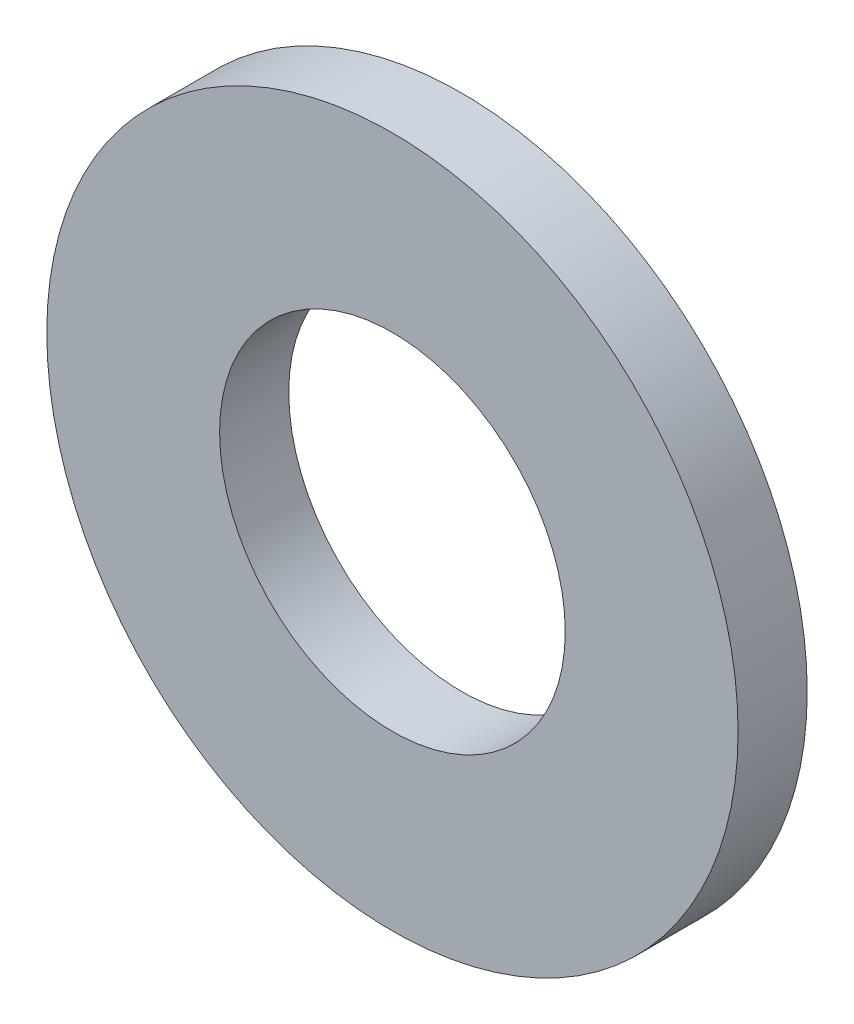
ISO-10303-21;
HEADER;
FILE_DESCRIPTION(('STEP AP214'),'2;1');
FILE_NAME('part.step','',(''),(''),'','','');
FILE_SCHEMA(('AUTOMOTIVE_DESIGN { 1 0 10303 214 1 1 1 1 }'));
ENDSEC;
DATA;
#1=APPLICATION_CONTEXT('core data for automotive mechanical design processes');
#2=APPLICATION_PROTOCOL_DEFINITION('international standard','automotive_design',2000,#1);
#3=PRODUCT_CONTEXT('',#1,'mechanical');
#4=PRODUCT('Part','Part','',(#3));
#5=PRODUCT_RELATED_PRODUCT_CATEGORY('part','',(#4));
#6=PRODUCT_DEFINITION_FORMATION('','',#4);
#7=PRODUCT_DEFINITION_CONTEXT('part definition',#1,'design');
#8=PRODUCT_DEFINITION('design','',#6,#7);
#9=PRODUCT_DEFINITION_SHAPE('','',#8);
#10=(LENGTH_UNIT() NAMED_UNIT(*) SI_UNIT(.MILLI.,.METRE.));
#11=(NAMED_UNIT(*) PLANE_ANGLE_UNIT() SI_UNIT($,.RADIAN.));
#12=(NAMED_UNIT(*) SI_UNIT($,.STERADIAN.) SOLID_ANGLE_UNIT());
#13=UNCERTAINTY_MEASURE_WITH_UNIT(LENGTH_MEASURE(1.E-05),#10,'distance_accuracy_value','');
#14=(GEOMETRIC_REPRESENTATION_CONTEXT(3) GLOBAL_UNCERTAINTY_ASSIGNED_CONTEXT((#13)) GLOBAL_UNIT_ASSIGNED_CONTEXT((#10,
#11,#12)) REPRESENTATION_CONTEXT('',''));
#15=CARTESIAN_POINT('',(0.,0.,0.));
#16=DIRECTION('',(0.,0.,1.));
#17=DIRECTION('',(1.,0.,0.));
#18=AXIS2_PLACEMENT_3D('',#15,#16,#17);
#19=CARTESIAN_POINT('',(0.,0.,5.));
#20=DIRECTION('',(0.,0.,1.));
#21=DIRECTION('',(1.,0.,0.));
#22=AXIS2_PLACEMENT_3D('',#19,#20,#21);
#23=PLANE('',#22);
#24=CARTESIAN_POINT('',(0.,0.,5.));
#25=DIRECTION('',(0.,0.,1.));
#26=DIRECTION('',(1.,0.,0.));
#27=AXIS2_PLACEMENT_3D('',#24,#25,#26);
#28=CIRCLE('',#27,25.);
#29=CARTESIAN_POINT('',(25.,0.,5.));
#30=VERTEX_POINT('',#29);
#31=EDGE_CURVE('E10',#30,#30,#28,.T.);
#32=ORIENTED_EDGE('',*,*,#31,.T.);
#33=EDGE_LOOP('',(#32));
#34=FACE_BOUND('',#33,.T.);
#35=CARTESIAN_POINT('',(0.,0.,5.));
#36=DIRECTION('',(0.,0.,1.));
#37=DIRECTION('',(1.,0.,0.));
#38=AXIS2_PLACEMENT_3D('',#35,#36,#37);
#39=CIRCLE('',#38,12.5);
#40=CARTESIAN_POINT('',(12.5,0.,5.));
#41=VERTEX_POINT('',#40);
#42=EDGE_CURVE('E56',#41,#41,#39,.T.);
#43=ORIENTED_EDGE('',*,*,#42,.F.);
#44=EDGE_LOOP('',(#43));
#45=FACE_BOUND('',#44,.T.);
#46=ADVANCED_FACE('F43',(#34,#45),#23,.T.);
#47=CARTESIAN_POINT('',(0.,0.,0.));
#48=DIRECTION('',(0.,0.,1.));
#49=DIRECTION('',(1.,0.,0.));
#50=AXIS2_PLACEMENT_3D('',#47,#48,#49);
#51=PLANE('',#50);
#52=CARTESIAN_POINT('',(0.,0.,0.));
#53=DIRECTION('',(0.,0.,1.));
#54=DIRECTION('',(1.,0.,0.));
#55=AXIS2_PLACEMENT_3D('',#52,#53,#54);
#56=CIRCLE('',#55,25.);
#57=CARTESIAN_POINT('',(25.,0.,0.));
#58=VERTEX_POINT('',#57);
#59=EDGE_CURVE('E47',#58,#58,#56,.T.);
#60=ORIENTED_EDGE('',*,*,#59,.F.);
#61=EDGE_LOOP('',(#60));
#62=FACE_BOUND('',#61,.T.);
#63=CARTESIAN_POINT('',(0.,0.,0.));
#64=DIRECTION('',(0.,0.,1.));
#65=DIRECTION('',(1.,0.,0.));
#66=AXIS2_PLACEMENT_3D('',#63,#64,#65);
#67=CIRCLE('',#66,12.5);
#68=CARTESIAN_POINT('',(12.5,0.,0.));
#69=VERTEX_POINT('',#68);
#70=EDGE_CURVE('E58',#69,#69,#67,.T.);
#71=ORIENTED_EDGE('',*,*,#70,.T.);
#72=EDGE_LOOP('',(#71));
#73=FACE_BOUND('',#72,.T.);
#74=ADVANCED_FACE('F70',(#62,#73),#51,.F.);
#75=CARTESIAN_POINT('',(0.,0.,5.));
#76=DIRECTION('',(0.,0.,-1.));
#77=DIRECTION('',(-1.,0.,0.));
#78=AXIS2_PLACEMENT_3D('',#75,#76,#77);
#79=CYLINDRICAL_SURFACE('',#78,25.);
#80=ORIENTED_EDGE('',*,*,#31,.F.);
#81=EDGE_LOOP('',(#80));
#82=FACE_BOUND('',#81,.T.);
#83=ORIENTED_EDGE('',*,*,#59,.T.);
#84=EDGE_LOOP('',(#83));
#85=FACE_BOUND('',#84,.T.);
#86=ADVANCED_FACE('F45',(#82,#85),#79,.T.);
#87=CARTESIAN_POINT('',(0.,0.,5.));
#88=DIRECTION('',(0.,0.,-1.));
#89=DIRECTION('',(-1.,0.,0.));
#90=AXIS2_PLACEMENT_3D('',#87,#88,#89);
#91=CYLINDRICAL_SURFACE('',#90,12.5);
#92=ORIENTED_EDGE('',*,*,#42,.T.);
#93=EDGE_LOOP('',(#92));
#94=FACE_BOUND('',#93,.T.);
#95=ORIENTED_EDGE('',*,*,#70,.F.);
#96=EDGE_LOOP('',(#95));
#97=FACE_BOUND('',#96,.T.);
#98=ADVANCED_FACE('F66',(#94,#97),#91,.F.);
#99=CLOSED_SHELL('',(#46,#74,#86,#98));
#100=MANIFOLD_SOLID_BREP('B2',#99);
#101=ADVANCED_BREP_SHAPE_REPRESENTATION('',(#18,#100),#14);
#102=SHAPE_DEFINITION_REPRESENTATION(#9,#101);
ENDSEC;
END-ISO-10303-21;
